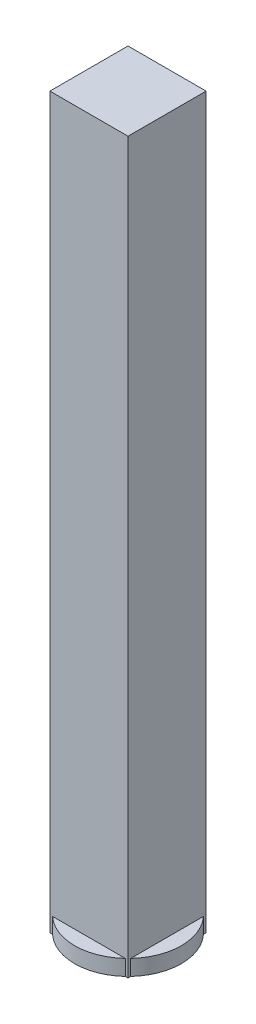
ISO-10303-21;
HEADER;
FILE_DESCRIPTION(('STEP AP214'),'2;1');
FILE_NAME('part.step','',(''),(''),'','','');
FILE_SCHEMA(('AUTOMOTIVE_DESIGN { 1 0 10303 214 1 1 1 1 }'));
ENDSEC;
DATA;
#1=APPLICATION_CONTEXT('core data for automotive mechanical design processes');
#2=APPLICATION_PROTOCOL_DEFINITION('international standard','automotive_design',2000,#1);
#3=PRODUCT_CONTEXT('',#1,'mechanical');
#4=PRODUCT('Part','Part','',(#3));
#5=PRODUCT_RELATED_PRODUCT_CATEGORY('part','',(#4));
#6=PRODUCT_DEFINITION_FORMATION('','',#4);
#7=PRODUCT_DEFINITION_CONTEXT('part definition',#1,'design');
#8=PRODUCT_DEFINITION('design','',#6,#7);
#9=PRODUCT_DEFINITION_SHAPE('','',#8);
#10=(LENGTH_UNIT() NAMED_UNIT(*) SI_UNIT(.MILLI.,.METRE.));
#11=(NAMED_UNIT(*) PLANE_ANGLE_UNIT() SI_UNIT($,.RADIAN.));
#12=(NAMED_UNIT(*) SI_UNIT($,.STERADIAN.) SOLID_ANGLE_UNIT());
#13=UNCERTAINTY_MEASURE_WITH_UNIT(LENGTH_MEASURE(1.E-05),#10,'distance_accuracy_value','');
#14=(GEOMETRIC_REPRESENTATION_CONTEXT(3) GLOBAL_UNCERTAINTY_ASSIGNED_CONTEXT((#13)) GLOBAL_UNIT_ASSIGNED_CONTEXT((#10,
#11,#12)) REPRESENTATION_CONTEXT('',''));
#15=CARTESIAN_POINT('',(0.,0.,0.));
#16=DIRECTION('',(0.,0.,1.));
#17=DIRECTION('',(1.,0.,0.));
#18=AXIS2_PLACEMENT_3D('',#15,#16,#17);
#19=CARTESIAN_POINT('',(30.,560.,30.));
#20=DIRECTION('',(-1.,0.,0.));
#21=DIRECTION('',(0.,0.,1.));
#22=AXIS2_PLACEMENT_3D('',#19,#20,#21);
#23=PLANE('',#22);
#24=DIRECTION('',(0.,-1.,0.));
#25=VECTOR('',#24,1.);
#26=CARTESIAN_POINT('',(30.,12.,-27.9463772249642));
#27=LINE('',#26,#25);
#28=CARTESIAN_POINT('',(30.,0.,-27.9463772249642));
#29=VERTEX_POINT('',#28);
#30=CARTESIAN_POINT('',(30.,12.,-27.9463772249642));
#31=VERTEX_POINT('',#30);
#32=EDGE_CURVE('E188',#29,#31,#27,.F.);
#33=ORIENTED_EDGE('',*,*,#32,.F.);
#34=DIRECTION('',(0.,0.,-1.));
#35=VECTOR('',#34,1.);
#36=CARTESIAN_POINT('',(30.,0.,30.));
#37=LINE('',#36,#35);
#38=CARTESIAN_POINT('',(30.,0.,-30.));
#39=VERTEX_POINT('',#38);
#40=EDGE_CURVE('E199',#29,#39,#37,.T.);
#41=ORIENTED_EDGE('',*,*,#40,.T.);
#42=DIRECTION('',(0.,-1.,0.));
#43=VECTOR('',#42,1.);
#44=CARTESIAN_POINT('',(30.,560.,-30.));
#45=LINE('',#44,#43);
#46=CARTESIAN_POINT('',(30.,560.,-30.));
#47=VERTEX_POINT('',#46);
#48=EDGE_CURVE('E46',#47,#39,#45,.T.);
#49=ORIENTED_EDGE('',*,*,#48,.F.);
#50=DIRECTION('',(0.,0.,-1.));
#51=VECTOR('',#50,1.);
#52=CARTESIAN_POINT('',(30.,560.,30.));
#53=LINE('',#52,#51);
#54=CARTESIAN_POINT('',(30.,560.,30.));
#55=VERTEX_POINT('',#54);
#56=EDGE_CURVE('E200',#55,#47,#53,.T.);
#57=ORIENTED_EDGE('',*,*,#56,.F.);
#58=DIRECTION('',(0.,-1.,0.));
#59=VECTOR('',#58,1.);
#60=CARTESIAN_POINT('',(30.,560.,30.));
#61=LINE('',#60,#59);
#62=CARTESIAN_POINT('',(30.,0.,30.));
#63=VERTEX_POINT('',#62);
#64=EDGE_CURVE('E209',#55,#63,#61,.T.);
#65=ORIENTED_EDGE('',*,*,#64,.T.);
#66=CARTESIAN_POINT('',(30.,0.,27.9463772249642));
#67=VERTEX_POINT('',#66);
#68=EDGE_CURVE('E132',#63,#67,#37,.T.);
#69=ORIENTED_EDGE('',*,*,#68,.T.);
#70=DIRECTION('',(0.,-1.,0.));
#71=VECTOR('',#70,1.);
#72=CARTESIAN_POINT('',(30.,12.,27.9463772249642));
#73=LINE('',#72,#71);
#74=CARTESIAN_POINT('',(30.,12.,27.9463772249642));
#75=VERTEX_POINT('',#74);
#76=EDGE_CURVE('E58',#75,#67,#73,.T.);
#77=ORIENTED_EDGE('',*,*,#76,.F.);
#78=DIRECTION('',(0.,0.,-1.));
#79=VECTOR('',#78,1.);
#80=CARTESIAN_POINT('',(30.,12.,30.));
#81=LINE('',#80,#79);
#82=EDGE_CURVE('E53',#75,#31,#81,.T.);
#83=ORIENTED_EDGE('',*,*,#82,.T.);
#84=EDGE_LOOP('',(#33,#41,#49,#57,#65,#69,#77,#83));
#85=FACE_BOUND('',#84,.T.);
#86=ADVANCED_FACE('F39',(#85),#23,.F.);
#87=CARTESIAN_POINT('',(-30.,560.,-30.));
#88=DIRECTION('',(0.,0.,1.));
#89=DIRECTION('',(1.,0.,0.));
#90=AXIS2_PLACEMENT_3D('',#87,#88,#89);
#91=PLANE('',#90);
#92=DIRECTION('',(0.,-1.,0.));
#93=VECTOR('',#92,1.);
#94=CARTESIAN_POINT('',(-27.9463772249642,12.,-30.));
#95=LINE('',#94,#93);
#96=CARTESIAN_POINT('',(-27.9463772249642,0.,-30.));
#97=VERTEX_POINT('',#96);
#98=CARTESIAN_POINT('',(-27.9463772249642,12.,-30.));
#99=VERTEX_POINT('',#98);
#100=EDGE_CURVE('E171',#97,#99,#95,.F.);
#101=ORIENTED_EDGE('',*,*,#100,.F.);
#102=DIRECTION('',(-1.,0.,0.));
#103=VECTOR('',#102,1.);
#104=CARTESIAN_POINT('',(-30.,0.,-30.));
#105=LINE('',#104,#103);
#106=CARTESIAN_POINT('',(-30.,0.,-30.));
#107=VERTEX_POINT('',#106);
#108=EDGE_CURVE('E178',#97,#107,#105,.T.);
#109=ORIENTED_EDGE('',*,*,#108,.T.);
#110=DIRECTION('',(0.,-1.,0.));
#111=VECTOR('',#110,1.);
#112=CARTESIAN_POINT('',(-30.,560.,-30.));
#113=LINE('',#112,#111);
#114=CARTESIAN_POINT('',(-30.,560.,-30.));
#115=VERTEX_POINT('',#114);
#116=EDGE_CURVE('E217',#115,#107,#113,.T.);
#117=ORIENTED_EDGE('',*,*,#116,.F.);
#118=DIRECTION('',(-1.,0.,0.));
#119=VECTOR('',#118,1.);
#120=CARTESIAN_POINT('',(-30.,560.,-30.));
#121=LINE('',#120,#119);
#122=EDGE_CURVE('E203',#47,#115,#121,.T.);
#123=ORIENTED_EDGE('',*,*,#122,.F.);
#124=ORIENTED_EDGE('',*,*,#48,.T.);
#125=CARTESIAN_POINT('',(27.9463772249642,0.,-30.));
#126=VERTEX_POINT('',#125);
#127=EDGE_CURVE('E175',#39,#126,#105,.T.);
#128=ORIENTED_EDGE('',*,*,#127,.T.);
#129=DIRECTION('',(0.,-1.,0.));
#130=VECTOR('',#129,1.);
#131=CARTESIAN_POINT('',(27.9463772249642,12.,-30.));
#132=LINE('',#131,#130);
#133=CARTESIAN_POINT('',(27.9463772249642,12.,-30.));
#134=VERTEX_POINT('',#133);
#135=EDGE_CURVE('E173',#134,#126,#132,.T.);
#136=ORIENTED_EDGE('',*,*,#135,.F.);
#137=DIRECTION('',(-1.,0.,0.));
#138=VECTOR('',#137,1.);
#139=CARTESIAN_POINT('',(-30.,12.,-30.));
#140=LINE('',#139,#138);
#141=EDGE_CURVE('E186',#134,#99,#140,.T.);
#142=ORIENTED_EDGE('',*,*,#141,.T.);
#143=EDGE_LOOP('',(#101,#109,#117,#123,#124,#128,#136,#142));
#144=FACE_BOUND('',#143,.T.);
#145=ADVANCED_FACE('F184',(#144),#91,.F.);
#146=CARTESIAN_POINT('',(-30.,560.,30.));
#147=DIRECTION('',(1.,0.,0.));
#148=DIRECTION('',(0.,0.,-1.));
#149=AXIS2_PLACEMENT_3D('',#146,#147,#148);
#150=PLANE('',#149);
#151=DIRECTION('',(0.,-1.,0.));
#152=VECTOR('',#151,1.);
#153=CARTESIAN_POINT('',(-30.,12.,27.9463772249642));
#154=LINE('',#153,#152);
#155=CARTESIAN_POINT('',(-30.,0.,27.9463772249642));
#156=VERTEX_POINT('',#155);
#157=CARTESIAN_POINT('',(-30.,12.,27.9463772249642));
#158=VERTEX_POINT('',#157);
#159=EDGE_CURVE('E190',#156,#158,#154,.F.);
#160=ORIENTED_EDGE('',*,*,#159,.F.);
#161=DIRECTION('',(0.,0.,1.));
#162=VECTOR('',#161,1.);
#163=CARTESIAN_POINT('',(-30.,0.,30.));
#164=LINE('',#163,#162);
#165=CARTESIAN_POINT('',(-30.,0.,30.));
#166=VERTEX_POINT('',#165);
#167=EDGE_CURVE('E211',#156,#166,#164,.T.);
#168=ORIENTED_EDGE('',*,*,#167,.T.);
#169=DIRECTION('',(0.,-1.,0.));
#170=VECTOR('',#169,1.);
#171=CARTESIAN_POINT('',(-30.,560.,30.));
#172=LINE('',#171,#170);
#173=CARTESIAN_POINT('',(-30.,560.,30.));
#174=VERTEX_POINT('',#173);
#175=EDGE_CURVE('E214',#174,#166,#172,.T.);
#176=ORIENTED_EDGE('',*,*,#175,.F.);
#177=DIRECTION('',(0.,0.,1.));
#178=VECTOR('',#177,1.);
#179=CARTESIAN_POINT('',(-30.,560.,30.));
#180=LINE('',#179,#178);
#181=EDGE_CURVE('E205',#115,#174,#180,.T.);
#182=ORIENTED_EDGE('',*,*,#181,.F.);
#183=ORIENTED_EDGE('',*,*,#116,.T.);
#184=CARTESIAN_POINT('',(-30.,0.,-27.9463772249642));
#185=VERTEX_POINT('',#184);
#186=EDGE_CURVE('E137',#107,#185,#164,.T.);
#187=ORIENTED_EDGE('',*,*,#186,.T.);
#188=DIRECTION('',(0.,-1.,0.));
#189=VECTOR('',#188,1.);
#190=CARTESIAN_POINT('',(-30.,12.,-27.9463772249642));
#191=LINE('',#190,#189);
#192=CARTESIAN_POINT('',(-30.,12.,-27.9463772249642));
#193=VERTEX_POINT('',#192);
#194=EDGE_CURVE('E146',#193,#185,#191,.T.);
#195=ORIENTED_EDGE('',*,*,#194,.F.);
#196=DIRECTION('',(0.,0.,1.));
#197=VECTOR('',#196,1.);
#198=CARTESIAN_POINT('',(-30.,12.,30.));
#199=LINE('',#198,#197);
#200=EDGE_CURVE('E195',#193,#158,#199,.T.);
#201=ORIENTED_EDGE('',*,*,#200,.T.);
#202=EDGE_LOOP('',(#160,#168,#176,#182,#183,#187,#195,#201));
#203=FACE_BOUND('',#202,.T.);
#204=ADVANCED_FACE('F239',(#203),#150,.F.);
#205=CARTESIAN_POINT('',(-30.,560.,30.));
#206=DIRECTION('',(0.,0.,-1.));
#207=DIRECTION('',(-1.,0.,0.));
#208=AXIS2_PLACEMENT_3D('',#205,#206,#207);
#209=PLANE('',#208);
#210=DIRECTION('',(0.,-1.,0.));
#211=VECTOR('',#210,1.);
#212=CARTESIAN_POINT('',(27.9463772249642,12.,30.));
#213=LINE('',#212,#211);
#214=CARTESIAN_POINT('',(27.9463772249642,0.,30.));
#215=VERTEX_POINT('',#214);
#216=CARTESIAN_POINT('',(27.9463772249642,12.,30.));
#217=VERTEX_POINT('',#216);
#218=EDGE_CURVE('E140',#215,#217,#213,.F.);
#219=ORIENTED_EDGE('',*,*,#218,.F.);
#220=DIRECTION('',(1.,0.,0.));
#221=VECTOR('',#220,1.);
#222=CARTESIAN_POINT('',(-30.,0.,30.));
#223=LINE('',#222,#221);
#224=EDGE_CURVE('E125',#215,#63,#223,.T.);
#225=ORIENTED_EDGE('',*,*,#224,.T.);
#226=ORIENTED_EDGE('',*,*,#64,.F.);
#227=DIRECTION('',(1.,0.,0.));
#228=VECTOR('',#227,1.);
#229=CARTESIAN_POINT('',(-30.,560.,30.));
#230=LINE('',#229,#228);
#231=EDGE_CURVE('E207',#174,#55,#230,.T.);
#232=ORIENTED_EDGE('',*,*,#231,.F.);
#233=ORIENTED_EDGE('',*,*,#175,.T.);
#234=CARTESIAN_POINT('',(-27.9463772249642,0.,30.));
#235=VERTEX_POINT('',#234);
#236=EDGE_CURVE('E136',#166,#235,#223,.T.);
#237=ORIENTED_EDGE('',*,*,#236,.T.);
#238=DIRECTION('',(0.,-1.,0.));
#239=VECTOR('',#238,1.);
#240=CARTESIAN_POINT('',(-27.9463772249642,12.,30.));
#241=LINE('',#240,#239);
#242=CARTESIAN_POINT('',(-27.9463772249642,12.,30.));
#243=VERTEX_POINT('',#242);
#244=EDGE_CURVE('E147',#243,#235,#241,.T.);
#245=ORIENTED_EDGE('',*,*,#244,.F.);
#246=DIRECTION('',(1.,0.,0.));
#247=VECTOR('',#246,1.);
#248=CARTESIAN_POINT('',(-30.,12.,30.));
#249=LINE('',#248,#247);
#250=EDGE_CURVE('E11',#243,#217,#249,.T.);
#251=ORIENTED_EDGE('',*,*,#250,.T.);
#252=EDGE_LOOP('',(#219,#225,#226,#232,#233,#237,#245,#251));
#253=FACE_BOUND('',#252,.T.);
#254=ADVANCED_FACE('F141',(#253),#209,.F.);
#255=CARTESIAN_POINT('',(0.,560.,0.));
#256=DIRECTION('',(0.,-1.,0.));
#257=DIRECTION('',(0.,0.,-1.));
#258=AXIS2_PLACEMENT_3D('',#255,#256,#257);
#259=PLANE('',#258);
#260=ORIENTED_EDGE('',*,*,#56,.T.);
#261=ORIENTED_EDGE('',*,*,#122,.T.);
#262=ORIENTED_EDGE('',*,*,#181,.T.);
#263=ORIENTED_EDGE('',*,*,#231,.T.);
#264=EDGE_LOOP('',(#260,#261,#262,#263));
#265=FACE_BOUND('',#264,.T.);
#266=ADVANCED_FACE('F244',(#265),#259,.F.);
#267=CARTESIAN_POINT('',(0.,0.,0.));
#268=DIRECTION('',(0.,-1.,0.));
#269=DIRECTION('',(0.,0.,-1.));
#270=AXIS2_PLACEMENT_3D('',#267,#268,#269);
#271=PLANE('',#270);
#272=ORIENTED_EDGE('',*,*,#40,.F.);
#273=CARTESIAN_POINT('',(0.,0.,0.));
#274=DIRECTION('',(0.,1.,0.));
#275=DIRECTION('',(0.,0.,1.));
#276=AXIS2_PLACEMENT_3D('',#273,#274,#275);
#277=CIRCLE('',#276,41.);
#278=EDGE_CURVE('E153',#67,#29,#277,.T.);
#279=ORIENTED_EDGE('',*,*,#278,.F.);
#280=ORIENTED_EDGE('',*,*,#68,.F.);
#281=ORIENTED_EDGE('',*,*,#224,.F.);
#282=EDGE_CURVE('E130',#235,#215,#277,.T.);
#283=ORIENTED_EDGE('',*,*,#282,.F.);
#284=ORIENTED_EDGE('',*,*,#236,.F.);
#285=ORIENTED_EDGE('',*,*,#167,.F.);
#286=EDGE_CURVE('E151',#185,#156,#277,.T.);
#287=ORIENTED_EDGE('',*,*,#286,.F.);
#288=ORIENTED_EDGE('',*,*,#186,.F.);
#289=ORIENTED_EDGE('',*,*,#108,.F.);
#290=EDGE_CURVE('E155',#126,#97,#277,.T.);
#291=ORIENTED_EDGE('',*,*,#290,.F.);
#292=ORIENTED_EDGE('',*,*,#127,.F.);
#293=EDGE_LOOP('',(#272,#279,#280,#281,#283,#284,#285,#287,#288,#289,#291,#292));
#294=FACE_BOUND('',#293,.T.);
#295=ADVANCED_FACE('F127',(#294),#271,.T.);
#296=CARTESIAN_POINT('',(0.,12.,0.));
#297=DIRECTION('',(0.,1.,0.));
#298=DIRECTION('',(0.,0.,1.));
#299=AXIS2_PLACEMENT_3D('',#296,#297,#298);
#300=PLANE('',#299);
#301=ORIENTED_EDGE('',*,*,#250,.F.);
#302=CARTESIAN_POINT('',(0.,12.,0.));
#303=DIRECTION('',(0.,1.,0.));
#304=DIRECTION('',(0.,0.,1.));
#305=AXIS2_PLACEMENT_3D('',#302,#303,#304);
#306=CIRCLE('',#305,41.);
#307=EDGE_CURVE('E159',#243,#217,#306,.T.);
#308=ORIENTED_EDGE('',*,*,#307,.T.);
#309=EDGE_LOOP('',(#301,#308));
#310=FACE_BOUND('',#309,.T.);
#311=ADVANCED_FACE('F246',(#310),#300,.T.);
#312=CARTESIAN_POINT('',(0.,12.,0.));
#313=DIRECTION('',(0.,-1.,0.));
#314=DIRECTION('',(0.,0.,-1.));
#315=AXIS2_PLACEMENT_3D('',#312,#313,#314);
#316=CYLINDRICAL_SURFACE('',#315,41.);
#317=ORIENTED_EDGE('',*,*,#282,.T.);
#318=ORIENTED_EDGE('',*,*,#218,.T.);
#319=ORIENTED_EDGE('',*,*,#307,.F.);
#320=ORIENTED_EDGE('',*,*,#244,.T.);
#321=EDGE_LOOP('',(#317,#318,#319,#320));
#322=FACE_BOUND('',#321,.T.);
#323=ADVANCED_FACE('F150',(#322),#316,.T.);
#324=ORIENTED_EDGE('',*,*,#200,.F.);
#325=EDGE_CURVE('E161',#193,#158,#306,.T.);
#326=ORIENTED_EDGE('',*,*,#325,.T.);
#327=EDGE_LOOP('',(#324,#326));
#328=FACE_BOUND('',#327,.T.);
#329=ADVANCED_FACE('F231',(#328),#300,.T.);
#330=ORIENTED_EDGE('',*,*,#286,.T.);
#331=ORIENTED_EDGE('',*,*,#159,.T.);
#332=ORIENTED_EDGE('',*,*,#325,.F.);
#333=ORIENTED_EDGE('',*,*,#194,.T.);
#334=EDGE_LOOP('',(#330,#331,#332,#333));
#335=FACE_BOUND('',#334,.T.);
#336=ADVANCED_FACE('F235',(#335),#316,.T.);
#337=ORIENTED_EDGE('',*,*,#141,.F.);
#338=EDGE_CURVE('E225',#134,#99,#306,.T.);
#339=ORIENTED_EDGE('',*,*,#338,.T.);
#340=EDGE_LOOP('',(#337,#339));
#341=FACE_BOUND('',#340,.T.);
#342=ADVANCED_FACE('F256',(#341),#300,.T.);
#343=ORIENTED_EDGE('',*,*,#290,.T.);
#344=ORIENTED_EDGE('',*,*,#100,.T.);
#345=ORIENTED_EDGE('',*,*,#338,.F.);
#346=ORIENTED_EDGE('',*,*,#135,.T.);
#347=EDGE_LOOP('',(#343,#344,#345,#346));
#348=FACE_BOUND('',#347,.T.);
#349=ADVANCED_FACE('F168',(#348),#316,.T.);
#350=ORIENTED_EDGE('',*,*,#82,.F.);
#351=EDGE_CURVE('E162',#75,#31,#306,.T.);
#352=ORIENTED_EDGE('',*,*,#351,.T.);
#353=EDGE_LOOP('',(#350,#352));
#354=FACE_BOUND('',#353,.T.);
#355=ADVANCED_FACE('F224',(#354),#300,.T.);
#356=ORIENTED_EDGE('',*,*,#278,.T.);
#357=ORIENTED_EDGE('',*,*,#32,.T.);
#358=ORIENTED_EDGE('',*,*,#351,.F.);
#359=ORIENTED_EDGE('',*,*,#76,.T.);
#360=EDGE_LOOP('',(#356,#357,#358,#359));
#361=FACE_BOUND('',#360,.T.);
#362=ADVANCED_FACE('F222',(#361),#316,.T.);
#363=CLOSED_SHELL('',(#86,#145,#204,#254,#266,#295,#311,#323,#329,#336,#342,#349,#355,#362));
#364=MANIFOLD_SOLID_BREP('B2',#363);
#365=ADVANCED_BREP_SHAPE_REPRESENTATION('',(#18,#364),#14);
#366=SHAPE_DEFINITION_REPRESENTATION(#9,#365);
ENDSEC;
END-ISO-10303-21;
